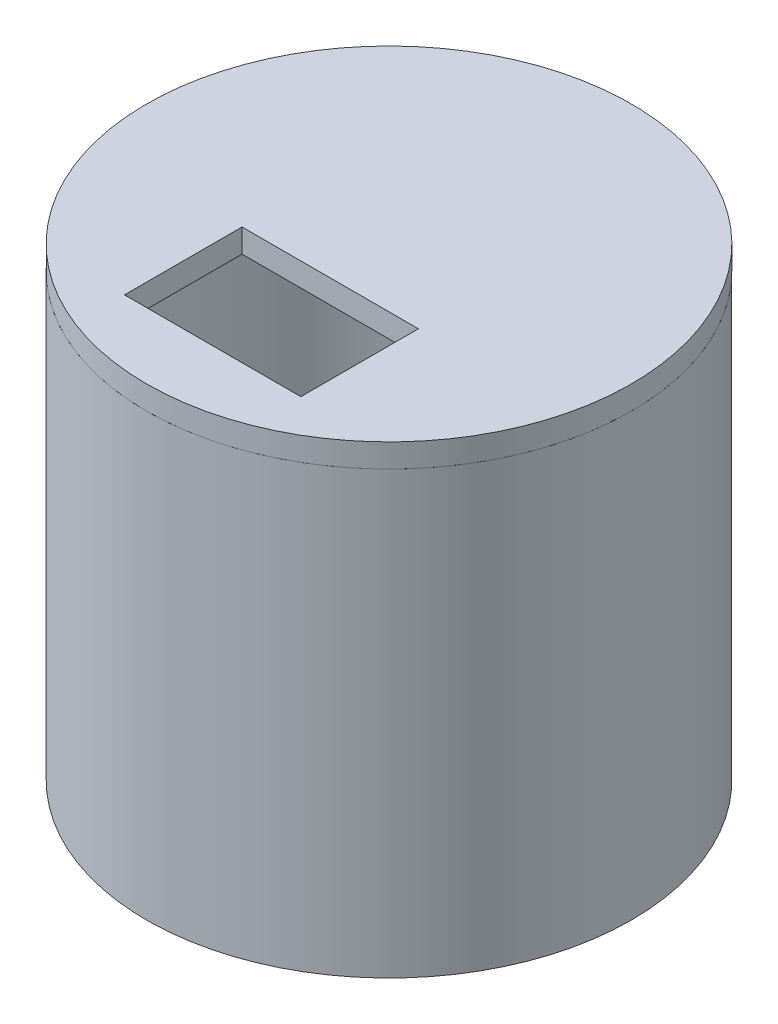
ISO-10303-21;
HEADER;
FILE_DESCRIPTION(('STEP AP214'),'2;1');
FILE_NAME('part.step','',(''),(''),'','','');
FILE_SCHEMA(('AUTOMOTIVE_DESIGN { 1 0 10303 214 1 1 1 1 }'));
ENDSEC;
DATA;
#1=APPLICATION_CONTEXT('core data for automotive mechanical design processes');
#2=APPLICATION_PROTOCOL_DEFINITION('international standard','automotive_design',2000,#1);
#3=PRODUCT_CONTEXT('',#1,'mechanical');
#4=PRODUCT('Part','Part','',(#3));
#5=PRODUCT_RELATED_PRODUCT_CATEGORY('part','',(#4));
#6=PRODUCT_DEFINITION_FORMATION('','',#4);
#7=PRODUCT_DEFINITION_CONTEXT('part definition',#1,'design');
#8=PRODUCT_DEFINITION('design','',#6,#7);
#9=PRODUCT_DEFINITION_SHAPE('','',#8);
#10=(LENGTH_UNIT() NAMED_UNIT(*) SI_UNIT(.MILLI.,.METRE.));
#11=(NAMED_UNIT(*) PLANE_ANGLE_UNIT() SI_UNIT($,.RADIAN.));
#12=(NAMED_UNIT(*) SI_UNIT($,.STERADIAN.) SOLID_ANGLE_UNIT());
#13=UNCERTAINTY_MEASURE_WITH_UNIT(LENGTH_MEASURE(1.E-05),#10,'distance_accuracy_value','');
#14=(GEOMETRIC_REPRESENTATION_CONTEXT(3) GLOBAL_UNCERTAINTY_ASSIGNED_CONTEXT((#13)) GLOBAL_UNIT_ASSIGNED_CONTEXT((#10,
#11,#12)) REPRESENTATION_CONTEXT('',''));
#15=CARTESIAN_POINT('',(0.,0.,0.));
#16=DIRECTION('',(0.,0.,1.));
#17=DIRECTION('',(1.,0.,0.));
#18=AXIS2_PLACEMENT_3D('',#15,#16,#17);
#19=CARTESIAN_POINT('',(0.,158.,0.));
#20=DIRECTION('',(0.,-1.,0.));
#21=DIRECTION('',(0.,0.,-1.));
#22=AXIS2_PLACEMENT_3D('',#19,#20,#21);
#23=CYLINDRICAL_SURFACE('',#22,82.5);
#24=CARTESIAN_POINT('',(0.,158.,0.));
#25=DIRECTION('',(0.,1.,0.));
#26=DIRECTION('',(0.,0.,1.));
#27=AXIS2_PLACEMENT_3D('',#24,#25,#26);
#28=CIRCLE('',#27,82.5);
#29=CARTESIAN_POINT('',(0.,158.,82.5));
#30=VERTEX_POINT('',#29);
#31=EDGE_CURVE('E120',#30,#30,#28,.T.);
#32=ORIENTED_EDGE('',*,*,#31,.F.);
#33=EDGE_LOOP('',(#32));
#34=FACE_BOUND('',#33,.T.);
#35=CARTESIAN_POINT('',(0.,150.,0.));
#36=DIRECTION('',(0.,1.,0.));
#37=DIRECTION('',(0.,0.,1.));
#38=AXIS2_PLACEMENT_3D('',#35,#36,#37);
#39=CIRCLE('',#38,82.5);
#40=CARTESIAN_POINT('',(0.,150.,82.5));
#41=VERTEX_POINT('',#40);
#42=EDGE_CURVE('E117',#41,#41,#39,.T.);
#43=ORIENTED_EDGE('',*,*,#42,.T.);
#44=EDGE_LOOP('',(#43));
#45=FACE_BOUND('',#44,.T.);
#46=ADVANCED_FACE('F51',(#34,#45),#23,.T.);
#47=CARTESIAN_POINT('',(0.,158.,0.));
#48=DIRECTION('',(0.,1.,0.));
#49=DIRECTION('',(0.,0.,1.));
#50=AXIS2_PLACEMENT_3D('',#47,#48,#49);
#51=PLANE('',#50);
#52=DIRECTION('',(0.,0.,-1.));
#53=VECTOR('',#52,1.);
#54=CARTESIAN_POINT('',(30.,158.,60.));
#55=LINE('',#54,#53);
#56=CARTESIAN_POINT('',(30.,158.,60.));
#57=VERTEX_POINT('',#56);
#58=CARTESIAN_POINT('',(30.,158.,20.));
#59=VERTEX_POINT('',#58);
#60=EDGE_CURVE('E65',#57,#59,#55,.T.);
#61=ORIENTED_EDGE('',*,*,#60,.F.);
#62=DIRECTION('',(-1.,0.,0.));
#63=VECTOR('',#62,1.);
#64=CARTESIAN_POINT('',(30.,158.,60.));
#65=LINE('',#64,#63);
#66=CARTESIAN_POINT('',(-30.,158.,60.));
#67=VERTEX_POINT('',#66);
#68=EDGE_CURVE('E110',#57,#67,#65,.T.);
#69=ORIENTED_EDGE('',*,*,#68,.T.);
#70=DIRECTION('',(0.,0.,-1.));
#71=VECTOR('',#70,1.);
#72=CARTESIAN_POINT('',(-30.,158.,60.));
#73=LINE('',#72,#71);
#74=CARTESIAN_POINT('',(-30.,158.,20.));
#75=VERTEX_POINT('',#74);
#76=EDGE_CURVE('E94',#67,#75,#73,.T.);
#77=ORIENTED_EDGE('',*,*,#76,.T.);
#78=DIRECTION('',(-1.,0.,0.));
#79=VECTOR('',#78,1.);
#80=CARTESIAN_POINT('',(30.,158.,20.));
#81=LINE('',#80,#79);
#82=EDGE_CURVE('E103',#59,#75,#81,.T.);
#83=ORIENTED_EDGE('',*,*,#82,.F.);
#84=EDGE_LOOP('',(#61,#69,#77,#83));
#85=FACE_BOUND('',#84,.T.);
#86=ORIENTED_EDGE('',*,*,#31,.T.);
#87=EDGE_LOOP('',(#86));
#88=FACE_BOUND('',#87,.T.);
#89=ADVANCED_FACE('F107',(#85,#88),#51,.T.);
#90=CARTESIAN_POINT('',(0.,150.,0.));
#91=DIRECTION('',(0.,1.,0.));
#92=DIRECTION('',(0.,0.,1.));
#93=AXIS2_PLACEMENT_3D('',#90,#91,#92);
#94=PLANE('',#93);
#95=DIRECTION('',(-1.,0.,0.));
#96=VECTOR('',#95,1.);
#97=CARTESIAN_POINT('',(0.,150.,60.));
#98=LINE('',#97,#96);
#99=CARTESIAN_POINT('',(30.,150.,60.));
#100=VERTEX_POINT('',#99);
#101=CARTESIAN_POINT('',(-30.,150.,60.));
#102=VERTEX_POINT('',#101);
#103=EDGE_CURVE('E58',#100,#102,#98,.T.);
#104=ORIENTED_EDGE('',*,*,#103,.F.);
#105=DIRECTION('',(0.,0.,-1.));
#106=VECTOR('',#105,1.);
#107=CARTESIAN_POINT('',(30.,150.,0.));
#108=LINE('',#107,#106);
#109=CARTESIAN_POINT('',(30.,150.,20.));
#110=VERTEX_POINT('',#109);
#111=EDGE_CURVE('E13',#100,#110,#108,.T.);
#112=ORIENTED_EDGE('',*,*,#111,.T.);
#113=DIRECTION('',(-1.,0.,0.));
#114=VECTOR('',#113,1.);
#115=CARTESIAN_POINT('',(0.,150.,20.));
#116=LINE('',#115,#114);
#117=CARTESIAN_POINT('',(-30.,150.,20.));
#118=VERTEX_POINT('',#117);
#119=EDGE_CURVE('E123',#110,#118,#116,.T.);
#120=ORIENTED_EDGE('',*,*,#119,.T.);
#121=DIRECTION('',(0.,0.,-1.));
#122=VECTOR('',#121,1.);
#123=CARTESIAN_POINT('',(-30.,150.,0.));
#124=LINE('',#123,#122);
#125=EDGE_CURVE('E97',#102,#118,#124,.T.);
#126=ORIENTED_EDGE('',*,*,#125,.F.);
#127=EDGE_LOOP('',(#104,#112,#120,#126));
#128=FACE_BOUND('',#127,.T.);
#129=ORIENTED_EDGE('',*,*,#42,.F.);
#130=EDGE_LOOP('',(#129));
#131=FACE_BOUND('',#130,.T.);
#132=ADVANCED_FACE('F132',(#128,#131),#94,.F.);
#133=CARTESIAN_POINT('',(30.,0.,60.));
#134=DIRECTION('',(1.,0.,0.));
#135=DIRECTION('',(0.,0.,-1.));
#136=AXIS2_PLACEMENT_3D('',#133,#134,#135);
#137=PLANE('',#136);
#138=DIRECTION('',(0.,1.,0.));
#139=VECTOR('',#138,1.);
#140=CARTESIAN_POINT('',(30.,0.,60.));
#141=LINE('',#140,#139);
#142=EDGE_CURVE('E115',#100,#57,#141,.T.);
#143=ORIENTED_EDGE('',*,*,#142,.T.);
#144=ORIENTED_EDGE('',*,*,#60,.T.);
#145=DIRECTION('',(0.,1.,0.));
#146=VECTOR('',#145,1.);
#147=CARTESIAN_POINT('',(30.,0.,20.));
#148=LINE('',#147,#146);
#149=EDGE_CURVE('E100',#110,#59,#148,.T.);
#150=ORIENTED_EDGE('',*,*,#149,.F.);
#151=ORIENTED_EDGE('',*,*,#111,.F.);
#152=EDGE_LOOP('',(#143,#144,#150,#151));
#153=FACE_BOUND('',#152,.T.);
#154=ADVANCED_FACE('F134',(#153),#137,.F.);
#155=CARTESIAN_POINT('',(30.,0.,60.));
#156=DIRECTION('',(0.,0.,-1.));
#157=DIRECTION('',(-1.,0.,0.));
#158=AXIS2_PLACEMENT_3D('',#155,#156,#157);
#159=PLANE('',#158);
#160=ORIENTED_EDGE('',*,*,#103,.T.);
#161=DIRECTION('',(0.,1.,0.));
#162=VECTOR('',#161,1.);
#163=CARTESIAN_POINT('',(-30.,0.,60.));
#164=LINE('',#163,#162);
#165=EDGE_CURVE('E99',#102,#67,#164,.T.);
#166=ORIENTED_EDGE('',*,*,#165,.T.);
#167=ORIENTED_EDGE('',*,*,#68,.F.);
#168=ORIENTED_EDGE('',*,*,#142,.F.);
#169=EDGE_LOOP('',(#160,#166,#167,#168));
#170=FACE_BOUND('',#169,.T.);
#171=ADVANCED_FACE('F130',(#170),#159,.T.);
#172=CARTESIAN_POINT('',(-30.,0.,60.));
#173=DIRECTION('',(1.,0.,0.));
#174=DIRECTION('',(0.,0.,-1.));
#175=AXIS2_PLACEMENT_3D('',#172,#173,#174);
#176=PLANE('',#175);
#177=ORIENTED_EDGE('',*,*,#125,.T.);
#178=DIRECTION('',(0.,1.,0.));
#179=VECTOR('',#178,1.);
#180=CARTESIAN_POINT('',(-30.,0.,20.));
#181=LINE('',#180,#179);
#182=EDGE_CURVE('E73',#118,#75,#181,.T.);
#183=ORIENTED_EDGE('',*,*,#182,.T.);
#184=ORIENTED_EDGE('',*,*,#76,.F.);
#185=ORIENTED_EDGE('',*,*,#165,.F.);
#186=EDGE_LOOP('',(#177,#183,#184,#185));
#187=FACE_BOUND('',#186,.T.);
#188=ADVANCED_FACE('F91',(#187),#176,.T.);
#189=CARTESIAN_POINT('',(30.,0.,20.));
#190=DIRECTION('',(0.,0.,-1.));
#191=DIRECTION('',(-1.,0.,0.));
#192=AXIS2_PLACEMENT_3D('',#189,#190,#191);
#193=PLANE('',#192);
#194=ORIENTED_EDGE('',*,*,#149,.T.);
#195=ORIENTED_EDGE('',*,*,#82,.T.);
#196=ORIENTED_EDGE('',*,*,#182,.F.);
#197=ORIENTED_EDGE('',*,*,#119,.F.);
#198=EDGE_LOOP('',(#194,#195,#196,#197));
#199=FACE_BOUND('',#198,.T.);
#200=ADVANCED_FACE('F104',(#199),#193,.F.);
#201=CLOSED_SHELL('',(#46,#89,#132,#154,#171,#188,#200));
#202=MANIFOLD_SOLID_BREP('B2',#201);
#203=CARTESIAN_POINT('',(0.,150.,0.));
#204=DIRECTION('',(0.,1.,0.));
#205=DIRECTION('',(0.,0.,1.));
#206=AXIS2_PLACEMENT_3D('',#203,#204,#205);
#207=PLANE('',#206);
#208=CARTESIAN_POINT('',(0.,150.,0.));
#209=DIRECTION('',(0.,1.,0.));
#210=DIRECTION('',(1.,0.,0.));
#211=AXIS2_PLACEMENT_3D('',#208,#209,#210);
#212=CIRCLE('',#211,82.5);
#213=CARTESIAN_POINT('',(82.5,150.,0.));
#214=VERTEX_POINT('',#213);
#215=EDGE_CURVE('E50',#214,#214,#212,.T.);
#216=ORIENTED_EDGE('',*,*,#215,.T.);
#217=EDGE_LOOP('',(#216));
#218=FACE_BOUND('',#217,.T.);
#219=CARTESIAN_POINT('',(0.,150.,0.));
#220=DIRECTION('',(0.,1.,0.));
#221=DIRECTION('',(0.,0.,1.));
#222=AXIS2_PLACEMENT_3D('',#219,#220,#221);
#223=CIRCLE('',#222,80.);
#224=CARTESIAN_POINT('',(0.,150.,80.));
#225=VERTEX_POINT('',#224);
#226=EDGE_CURVE('E207',#225,#225,#223,.T.);
#227=ORIENTED_EDGE('',*,*,#226,.F.);
#228=EDGE_LOOP('',(#227));
#229=FACE_BOUND('',#228,.T.);
#230=ADVANCED_FACE('F196',(#218,#229),#207,.T.);
#231=CARTESIAN_POINT('',(0.,0.,0.));
#232=DIRECTION('',(0.,1.,0.));
#233=DIRECTION('',(0.,0.,1.));
#234=AXIS2_PLACEMENT_3D('',#231,#232,#233);
#235=PLANE('',#234);
#236=CARTESIAN_POINT('',(0.,0.,0.));
#237=DIRECTION('',(0.,1.,0.));
#238=DIRECTION('',(1.,0.,0.));
#239=AXIS2_PLACEMENT_3D('',#236,#237,#238);
#240=CIRCLE('',#239,82.5);
#241=CARTESIAN_POINT('',(82.5,0.,0.));
#242=VERTEX_POINT('',#241);
#243=EDGE_CURVE('E200',#242,#242,#240,.T.);
#244=ORIENTED_EDGE('',*,*,#243,.F.);
#245=EDGE_LOOP('',(#244));
#246=FACE_BOUND('',#245,.T.);
#247=CARTESIAN_POINT('',(0.,0.,0.));
#248=DIRECTION('',(0.,1.,0.));
#249=DIRECTION('',(0.,0.,1.));
#250=AXIS2_PLACEMENT_3D('',#247,#248,#249);
#251=CIRCLE('',#250,80.);
#252=CARTESIAN_POINT('',(0.,0.,80.));
#253=VERTEX_POINT('',#252);
#254=EDGE_CURVE('E209',#253,#253,#251,.T.);
#255=ORIENTED_EDGE('',*,*,#254,.T.);
#256=EDGE_LOOP('',(#255));
#257=FACE_BOUND('',#256,.T.);
#258=ADVANCED_FACE('F219',(#246,#257),#235,.F.);
#259=CARTESIAN_POINT('',(0.,150.,0.));
#260=DIRECTION('',(0.,-1.,0.));
#261=DIRECTION('',(0.,0.,-1.));
#262=AXIS2_PLACEMENT_3D('',#259,#260,#261);
#263=CYLINDRICAL_SURFACE('',#262,82.5);
#264=ORIENTED_EDGE('',*,*,#215,.F.);
#265=EDGE_LOOP('',(#264));
#266=FACE_BOUND('',#265,.T.);
#267=ORIENTED_EDGE('',*,*,#243,.T.);
#268=EDGE_LOOP('',(#267));
#269=FACE_BOUND('',#268,.T.);
#270=ADVANCED_FACE('F198',(#266,#269),#263,.T.);
#271=CARTESIAN_POINT('',(0.,150.,0.));
#272=DIRECTION('',(0.,-1.,0.));
#273=DIRECTION('',(0.,0.,-1.));
#274=AXIS2_PLACEMENT_3D('',#271,#272,#273);
#275=CYLINDRICAL_SURFACE('',#274,80.);
#276=ORIENTED_EDGE('',*,*,#226,.T.);
#277=EDGE_LOOP('',(#276));
#278=FACE_BOUND('',#277,.T.);
#279=ORIENTED_EDGE('',*,*,#254,.F.);
#280=EDGE_LOOP('',(#279));
#281=FACE_BOUND('',#280,.T.);
#282=ADVANCED_FACE('F215',(#278,#281),#275,.F.);
#283=CLOSED_SHELL('',(#230,#258,#270,#282));
#284=MANIFOLD_SOLID_BREP('B7',#283);
#285=ADVANCED_BREP_SHAPE_REPRESENTATION('',(#18,#202,#284),#14);
#286=SHAPE_DEFINITION_REPRESENTATION(#9,#285);
ENDSEC;
END-ISO-10303-21;
